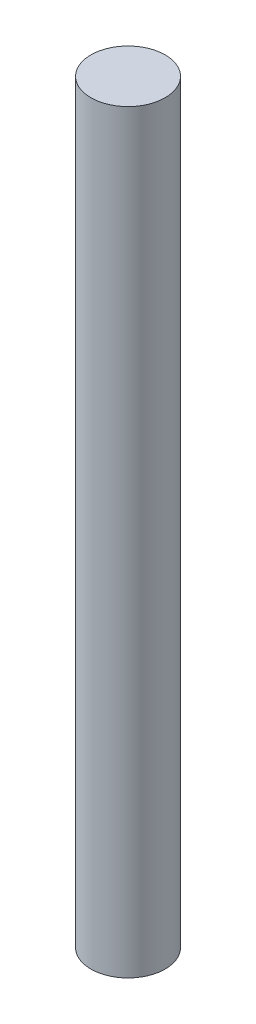
ISO-10303-21;
HEADER;
FILE_DESCRIPTION(('STEP AP214'),'2;1');
FILE_NAME('part.step','',(''),(''),'','','');
FILE_SCHEMA(('AUTOMOTIVE_DESIGN { 1 0 10303 214 1 1 1 1 }'));
ENDSEC;
DATA;
#1=APPLICATION_CONTEXT('core data for automotive mechanical design processes');
#2=APPLICATION_PROTOCOL_DEFINITION('international standard','automotive_design',2000,#1);
#3=PRODUCT_CONTEXT('',#1,'mechanical');
#4=PRODUCT('Part','Part','',(#3));
#5=PRODUCT_RELATED_PRODUCT_CATEGORY('part','',(#4));
#6=PRODUCT_DEFINITION_FORMATION('','',#4);
#7=PRODUCT_DEFINITION_CONTEXT('part definition',#1,'design');
#8=PRODUCT_DEFINITION('design','',#6,#7);
#9=PRODUCT_DEFINITION_SHAPE('','',#8);
#10=(LENGTH_UNIT() NAMED_UNIT(*) SI_UNIT(.MILLI.,.METRE.));
#11=(NAMED_UNIT(*) PLANE_ANGLE_UNIT() SI_UNIT($,.RADIAN.));
#12=(NAMED_UNIT(*) SI_UNIT($,.STERADIAN.) SOLID_ANGLE_UNIT());
#13=UNCERTAINTY_MEASURE_WITH_UNIT(LENGTH_MEASURE(1.E-05),#10,'distance_accuracy_value','');
#14=(GEOMETRIC_REPRESENTATION_CONTEXT(3) GLOBAL_UNCERTAINTY_ASSIGNED_CONTEXT((#13)) GLOBAL_UNIT_ASSIGNED_CONTEXT((#10,
#11,#12)) REPRESENTATION_CONTEXT('',''));
#15=CARTESIAN_POINT('',(0.,0.,0.));
#16=DIRECTION('',(0.,0.,1.));
#17=DIRECTION('',(1.,0.,0.));
#18=AXIS2_PLACEMENT_3D('',#15,#16,#17);
#19=CARTESIAN_POINT('',(0.,152.4,0.));
#20=DIRECTION('',(0.,-1.,0.));
#21=DIRECTION('',(0.,0.,-1.));
#22=AXIS2_PLACEMENT_3D('',#19,#20,#21);
#23=CYLINDRICAL_SURFACE('',#22,7.5);
#24=CARTESIAN_POINT('',(0.,152.4,0.));
#25=DIRECTION('',(0.,1.,0.));
#26=DIRECTION('',(0.,0.,1.));
#27=AXIS2_PLACEMENT_3D('',#24,#25,#26);
#28=CIRCLE('',#27,7.5);
#29=CARTESIAN_POINT('',(0.,152.4,-7.5));
#30=VERTEX_POINT('',#29);
#31=EDGE_CURVE('E10',#30,#30,#28,.T.);
#32=CARTESIAN_POINT('',(0.,0.,0.));
#33=DIRECTION('',(0.,1.,0.));
#34=DIRECTION('',(0.,0.,1.));
#35=AXIS2_PLACEMENT_3D('',#32,#33,#34);
#36=CIRCLE('',#35,7.5);
#37=CARTESIAN_POINT('',(0.,0.,-7.5));
#38=VERTEX_POINT('',#37);
#39=EDGE_CURVE('E34',#38,#38,#36,.T.);
#40=CARTESIAN_POINT('',(0.,152.4,-7.5));
#41=CARTESIAN_POINT('',(0.,150.8125,-7.5));
#42=CARTESIAN_POINT('',(0.,149.225,-7.5));
#43=CARTESIAN_POINT('',(0.,146.05,-7.5));
#44=CARTESIAN_POINT('',(0.,144.4625,-7.5));
#45=CARTESIAN_POINT('',(0.,141.2875,-7.5));
#46=CARTESIAN_POINT('',(0.,139.7,-7.5));
#47=CARTESIAN_POINT('',(0.,136.525,-7.5));
#48=CARTESIAN_POINT('',(0.,134.9375,-7.5));
#49=CARTESIAN_POINT('',(0.,131.7625,-7.5));
#50=CARTESIAN_POINT('',(0.,130.175,-7.5));
#51=CARTESIAN_POINT('',(0.,127.,-7.5));
#52=CARTESIAN_POINT('',(0.,125.4125,-7.5));
#53=CARTESIAN_POINT('',(0.,122.2375,-7.5));
#54=CARTESIAN_POINT('',(0.,120.65,-7.5));
#55=CARTESIAN_POINT('',(0.,117.475,-7.5));
#56=CARTESIAN_POINT('',(0.,115.8875,-7.5));
#57=CARTESIAN_POINT('',(0.,112.7125,-7.5));
#58=CARTESIAN_POINT('',(0.,111.125,-7.5));
#59=CARTESIAN_POINT('',(0.,107.95,-7.5));
#60=CARTESIAN_POINT('',(0.,106.3625,-7.5));
#61=CARTESIAN_POINT('',(0.,103.1875,-7.5));
#62=CARTESIAN_POINT('',(0.,101.6,-7.5));
#63=CARTESIAN_POINT('',(0.,98.425,-7.5));
#64=CARTESIAN_POINT('',(0.,96.8375,-7.5));
#65=CARTESIAN_POINT('',(0.,93.6625,-7.5));
#66=CARTESIAN_POINT('',(0.,92.075,-7.5));
#67=CARTESIAN_POINT('',(0.,88.9,-7.5));
#68=CARTESIAN_POINT('',(0.,87.3125,-7.5));
#69=CARTESIAN_POINT('',(0.,84.1375,-7.5));
#70=CARTESIAN_POINT('',(0.,82.55,-7.5));
#71=CARTESIAN_POINT('',(0.,79.375,-7.5));
#72=CARTESIAN_POINT('',(0.,77.7875,-7.5));
#73=CARTESIAN_POINT('',(0.,74.6125,-7.5));
#74=CARTESIAN_POINT('',(0.,73.025,-7.5));
#75=CARTESIAN_POINT('',(0.,69.85,-7.5));
#76=CARTESIAN_POINT('',(0.,68.2625,-7.5));
#77=CARTESIAN_POINT('',(0.,65.0875,-7.5));
#78=CARTESIAN_POINT('',(0.,63.5,-7.5));
#79=CARTESIAN_POINT('',(0.,60.325,-7.5));
#80=CARTESIAN_POINT('',(0.,58.7375,-7.5));
#81=CARTESIAN_POINT('',(0.,55.5625,-7.5));
#82=CARTESIAN_POINT('',(0.,53.975,-7.5));
#83=CARTESIAN_POINT('',(0.,50.8,-7.5));
#84=CARTESIAN_POINT('',(0.,49.2125,-7.5));
#85=CARTESIAN_POINT('',(0.,46.0375,-7.5));
#86=CARTESIAN_POINT('',(0.,44.45,-7.5));
#87=CARTESIAN_POINT('',(0.,41.275,-7.5));
#88=CARTESIAN_POINT('',(0.,39.6875,-7.5));
#89=CARTESIAN_POINT('',(0.,36.5125,-7.5));
#90=CARTESIAN_POINT('',(0.,34.925,-7.5));
#91=CARTESIAN_POINT('',(0.,31.75,-7.5));
#92=CARTESIAN_POINT('',(0.,30.1625,-7.5));
#93=CARTESIAN_POINT('',(0.,26.9875,-7.5));
#94=CARTESIAN_POINT('',(0.,25.4,-7.5));
#95=CARTESIAN_POINT('',(0.,22.225,-7.5));
#96=CARTESIAN_POINT('',(0.,20.6375,-7.5));
#97=CARTESIAN_POINT('',(0.,17.4625,-7.5));
#98=CARTESIAN_POINT('',(0.,15.875,-7.5));
#99=CARTESIAN_POINT('',(0.,12.7,-7.5));
#100=CARTESIAN_POINT('',(0.,11.1125,-7.5));
#101=CARTESIAN_POINT('',(0.,7.93750000000001,-7.5));
#102=CARTESIAN_POINT('',(0.,6.35,-7.5));
#103=CARTESIAN_POINT('',(0.,3.175,-7.5));
#104=CARTESIAN_POINT('',(0.,1.5875,-7.5));
#105=CARTESIAN_POINT('',(0.,0.,-7.5));
#106=B_SPLINE_CURVE_WITH_KNOTS('',3,(#40,#41,#42,#43,#44,#45,#46,#47,#48,#49,#50,#51,#52,#53,
#54,#55,#56,#57,#58,#59,#60,#61,#62,#63,#64,#65,#66,#67,#68,#69,#70,#71,#72,#73,#74,#75,#76,#77,
#78,#79,#80,#81,#82,#83,#84,#85,#86,#87,#88,#89,#90,#91,#92,#93,#94,#95,#96,#97,#98,#99,#100,
#101,#102,#103,#104,#105),.UNSPECIFIED.,.F.,.F.,(4,2,2,2,2,2,2,2,2,2,2,2,2,2,2,2,2,2,2,2,2,2,2,
2,2,2,2,2,2,2,2,2,4),(0.,4.76249999999998,9.52499999999998,14.2875,19.05,23.8125,28.575,33.3375,
38.1,42.8625,47.625,52.3875,57.15,61.9125,66.675,71.4375,76.2,80.9625,85.725,90.4875,95.25,
100.0125,104.775,109.5375,114.3,119.0625,123.825,128.5875,133.35,138.1125,142.875,147.6375,
152.4),.UNSPECIFIED.);
#107=EDGE_CURVE('BSEAM31',#30,#38,#106,.T.);
#108=ORIENTED_EDGE('',*,*,#31,.F.);
#109=ORIENTED_EDGE('',*,*,#39,.T.);
#110=ORIENTED_EDGE('',*,*,#107,.T.);
#111=ORIENTED_EDGE('',*,*,#107,.F.);
#112=EDGE_LOOP('',(#108,#110,#109,#111));
#113=FACE_BOUND('',#112,.T.);
#114=ADVANCED_FACE('F31',(#113),#23,.T.);
#115=CARTESIAN_POINT('',(0.,152.4,0.));
#116=DIRECTION('',(0.,1.,0.));
#117=DIRECTION('',(0.,0.,1.));
#118=AXIS2_PLACEMENT_3D('',#115,#116,#117);
#119=PLANE('',#118);
#120=ORIENTED_EDGE('',*,*,#31,.T.);
#121=EDGE_LOOP('',(#120));
#122=FACE_BOUND('',#121,.T.);
#123=ADVANCED_FACE('F46',(#122),#119,.T.);
#124=CARTESIAN_POINT('',(0.,0.,0.));
#125=DIRECTION('',(0.,1.,0.));
#126=DIRECTION('',(0.,0.,1.));
#127=AXIS2_PLACEMENT_3D('',#124,#125,#126);
#128=PLANE('',#127);
#129=ORIENTED_EDGE('',*,*,#39,.F.);
#130=EDGE_LOOP('',(#129));
#131=FACE_BOUND('',#130,.T.);
#132=ADVANCED_FACE('F44',(#131),#128,.F.);
#133=CLOSED_SHELL('',(#114,#123,#132));
#134=MANIFOLD_SOLID_BREP('B2',#133);
#135=ADVANCED_BREP_SHAPE_REPRESENTATION('',(#18,#134),#14);
#136=SHAPE_DEFINITION_REPRESENTATION(#9,#135);
ENDSEC;
END-ISO-10303-21;
